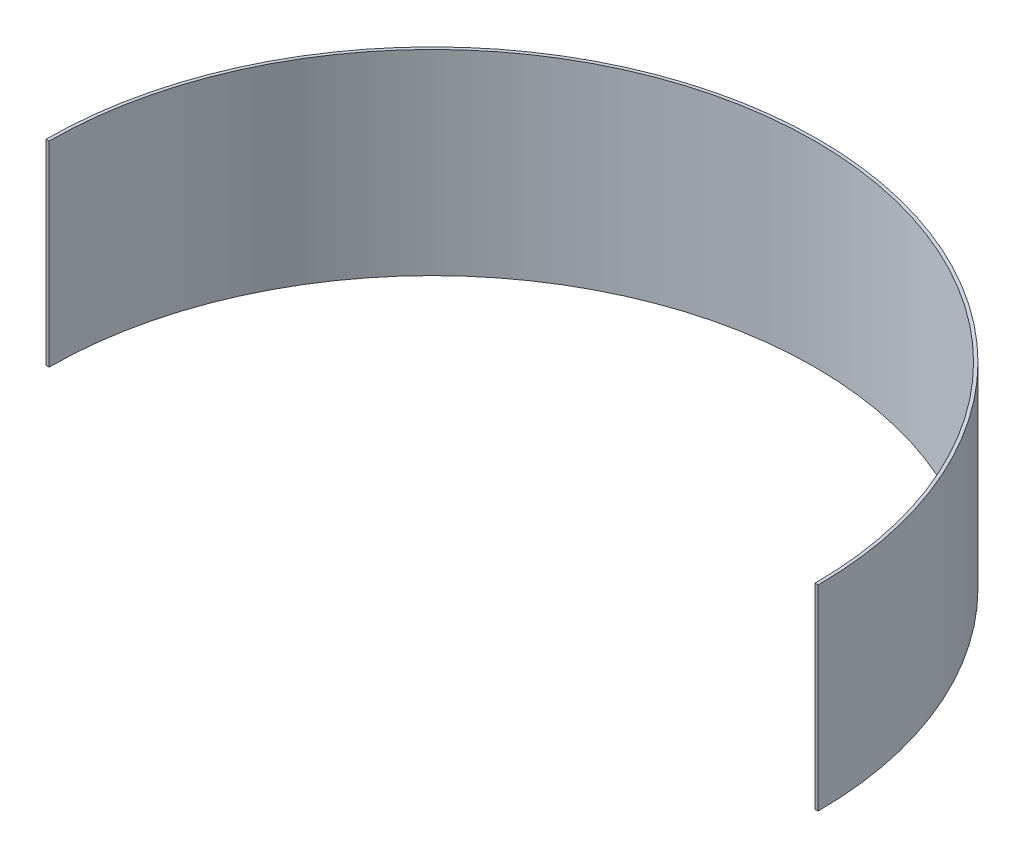
ISO-10303-21;
HEADER;
FILE_DESCRIPTION(('STEP AP214'),'2;1');
FILE_NAME('part.step','',(''),(''),'','','');
FILE_SCHEMA(('AUTOMOTIVE_DESIGN { 1 0 10303 214 1 1 1 1 }'));
ENDSEC;
DATA;
#1=APPLICATION_CONTEXT('core data for automotive mechanical design processes');
#2=APPLICATION_PROTOCOL_DEFINITION('international standard','automotive_design',2000,#1);
#3=PRODUCT_CONTEXT('',#1,'mechanical');
#4=PRODUCT('Part','Part','',(#3));
#5=PRODUCT_RELATED_PRODUCT_CATEGORY('part','',(#4));
#6=PRODUCT_DEFINITION_FORMATION('','',#4);
#7=PRODUCT_DEFINITION_CONTEXT('part definition',#1,'design');
#8=PRODUCT_DEFINITION('design','',#6,#7);
#9=PRODUCT_DEFINITION_SHAPE('','',#8);
#10=(LENGTH_UNIT() NAMED_UNIT(*) SI_UNIT(.MILLI.,.METRE.));
#11=(NAMED_UNIT(*) PLANE_ANGLE_UNIT() SI_UNIT($,.RADIAN.));
#12=(NAMED_UNIT(*) SI_UNIT($,.STERADIAN.) SOLID_ANGLE_UNIT());
#13=UNCERTAINTY_MEASURE_WITH_UNIT(LENGTH_MEASURE(1.E-05),#10,'distance_accuracy_value','');
#14=(GEOMETRIC_REPRESENTATION_CONTEXT(3) GLOBAL_UNCERTAINTY_ASSIGNED_CONTEXT((#13)) GLOBAL_UNIT_ASSIGNED_CONTEXT((#10,
#11,#12)) REPRESENTATION_CONTEXT('',''));
#15=CARTESIAN_POINT('',(0.,0.,0.));
#16=DIRECTION('',(0.,0.,1.));
#17=DIRECTION('',(1.,0.,0.));
#18=AXIS2_PLACEMENT_3D('',#15,#16,#17);
#19=CARTESIAN_POINT('',(0.,250.,0.));
#20=DIRECTION('',(0.,1.,0.));
#21=DIRECTION('',(0.,0.,1.));
#22=AXIS2_PLACEMENT_3D('',#19,#20,#21);
#23=PLANE('',#22);
#24=DIRECTION('',(-1.,0.,0.));
#25=VECTOR('',#24,1.);
#26=CARTESIAN_POINT('',(-985.5,250.,1.03638778409598E-13));
#27=LINE('',#26,#25);
#28=CARTESIAN_POINT('',(-977.5,250.,1.02169202250621E-13));
#29=VERTEX_POINT('',#28);
#30=CARTESIAN_POINT('',(-985.5,250.,1.03638778409598E-13));
#31=VERTEX_POINT('',#30);
#32=EDGE_CURVE('E12',#29,#31,#27,.T.);
#33=ORIENTED_EDGE('',*,*,#32,.F.);
#34=CARTESIAN_POINT('',(0.,250.,0.));
#35=DIRECTION('',(0.,-1.,0.));
#36=DIRECTION('',(0.,0.,-1.));
#37=AXIS2_PLACEMENT_3D('',#34,#35,#36);
#38=CIRCLE('',#37,977.5);
#39=CARTESIAN_POINT('',(977.5,250.,6.15716019112964E-12));
#40=VERTEX_POINT('',#39);
#41=EDGE_CURVE('E75',#29,#40,#38,.T.);
#42=ORIENTED_EDGE('',*,*,#41,.T.);
#43=DIRECTION('',(1.,0.,0.));
#44=VECTOR('',#43,1.);
#45=CARTESIAN_POINT('',(985.5,250.,5.98935972259897E-12));
#46=LINE('',#45,#44);
#47=CARTESIAN_POINT('',(985.5,250.,5.98935972259897E-12));
#48=VERTEX_POINT('',#47);
#49=EDGE_CURVE('E49',#40,#48,#46,.T.);
#50=ORIENTED_EDGE('',*,*,#49,.T.);
#51=CARTESIAN_POINT('',(0.,250.,0.));
#52=DIRECTION('',(0.,-1.,0.));
#53=DIRECTION('',(0.,0.,-1.));
#54=AXIS2_PLACEMENT_3D('',#51,#52,#53);
#55=CIRCLE('',#54,985.5);
#56=EDGE_CURVE('E78',#31,#48,#55,.T.);
#57=ORIENTED_EDGE('',*,*,#56,.F.);
#58=EDGE_LOOP('',(#33,#42,#50,#57));
#59=FACE_BOUND('',#58,.T.);
#60=ADVANCED_FACE('F39',(#59),#23,.T.);
#61=CARTESIAN_POINT('',(985.5,0.,6.18563175479426E-12));
#62=DIRECTION('',(0.,0.,1.));
#63=DIRECTION('',(0.,-1.,0.));
#64=AXIS2_PLACEMENT_3D('',#61,#62,#63);
#65=PLANE('',#64);
#66=ORIENTED_EDGE('',*,*,#49,.F.);
#67=DIRECTION('',(0.,-1.,0.));
#68=VECTOR('',#67,1.);
#69=CARTESIAN_POINT('',(977.5,3118.13511988646,6.15716019112964E-12));
#70=LINE('',#69,#68);
#71=CARTESIAN_POINT('',(977.5,-250.,6.15716019112964E-12));
#72=VERTEX_POINT('',#71);
#73=EDGE_CURVE('E90',#40,#72,#70,.T.);
#74=ORIENTED_EDGE('',*,*,#73,.T.);
#75=DIRECTION('',(1.,0.,0.));
#76=VECTOR('',#75,1.);
#77=CARTESIAN_POINT('',(985.5,-250.,6.18563175479426E-12));
#78=LINE('',#77,#76);
#79=CARTESIAN_POINT('',(985.5,-250.,6.18563175479426E-12));
#80=VERTEX_POINT('',#79);
#81=EDGE_CURVE('E99',#72,#80,#78,.T.);
#82=ORIENTED_EDGE('',*,*,#81,.T.);
#83=DIRECTION('',(0.,-1.,0.));
#84=VECTOR('',#83,1.);
#85=CARTESIAN_POINT('',(985.5,250.,6.18563175479426E-12));
#86=LINE('',#85,#84);
#87=EDGE_CURVE('E94',#48,#80,#86,.T.);
#88=ORIENTED_EDGE('',*,*,#87,.F.);
#89=EDGE_LOOP('',(#66,#74,#82,#88));
#90=FACE_BOUND('',#89,.T.);
#91=ADVANCED_FACE('F107',(#90),#65,.T.);
#92=CARTESIAN_POINT('',(0.,-250.,0.));
#93=DIRECTION('',(0.,-1.,0.));
#94=DIRECTION('',(0.,0.,-1.));
#95=AXIS2_PLACEMENT_3D('',#92,#93,#94);
#96=PLANE('',#95);
#97=ORIENTED_EDGE('',*,*,#81,.F.);
#98=CARTESIAN_POINT('',(0.,-250.,0.));
#99=DIRECTION('',(0.,-1.,0.));
#100=DIRECTION('',(0.,0.,-1.));
#101=AXIS2_PLACEMENT_3D('',#98,#99,#100);
#102=CIRCLE('',#101,977.5);
#103=CARTESIAN_POINT('',(-977.5,-250.,1.02169202250621E-13));
#104=VERTEX_POINT('',#103);
#105=EDGE_CURVE('E92',#72,#104,#102,.F.);
#106=ORIENTED_EDGE('',*,*,#105,.T.);
#107=DIRECTION('',(-1.,0.,0.));
#108=VECTOR('',#107,1.);
#109=CARTESIAN_POINT('',(-985.5,-250.,-2.58428047758317E-13));
#110=LINE('',#109,#108);
#111=CARTESIAN_POINT('',(-985.5,-250.,-2.58428047758317E-13));
#112=VERTEX_POINT('',#111);
#113=EDGE_CURVE('E43',#104,#112,#110,.T.);
#114=ORIENTED_EDGE('',*,*,#113,.T.);
#115=CARTESIAN_POINT('',(0.,-250.,0.));
#116=DIRECTION('',(0.,1.,0.));
#117=DIRECTION('',(0.,0.,1.));
#118=AXIS2_PLACEMENT_3D('',#115,#116,#117);
#119=CIRCLE('',#118,985.5);
#120=EDGE_CURVE('E108',#80,#112,#119,.T.);
#121=ORIENTED_EDGE('',*,*,#120,.F.);
#122=EDGE_LOOP('',(#97,#106,#114,#121));
#123=FACE_BOUND('',#122,.T.);
#124=ADVANCED_FACE('F112',(#123),#96,.T.);
#125=CARTESIAN_POINT('',(-985.5,0.,1.03638778409598E-13));
#126=DIRECTION('',(0.,0.,1.));
#127=DIRECTION('',(0.,1.,0.));
#128=AXIS2_PLACEMENT_3D('',#125,#126,#127);
#129=PLANE('',#128);
#130=DIRECTION('',(0.,-1.,0.));
#131=VECTOR('',#130,1.);
#132=CARTESIAN_POINT('',(-977.5,3118.13511988646,1.02169202250621E-13));
#133=LINE('',#132,#131);
#134=EDGE_CURVE('E88',#104,#29,#133,.F.);
#135=ORIENTED_EDGE('',*,*,#134,.T.);
#136=ORIENTED_EDGE('',*,*,#32,.T.);
#137=DIRECTION('',(0.,1.,0.));
#138=VECTOR('',#137,1.);
#139=CARTESIAN_POINT('',(-985.5,-250.,1.03638778409598E-13));
#140=LINE('',#139,#138);
#141=EDGE_CURVE('E106',#112,#31,#140,.T.);
#142=ORIENTED_EDGE('',*,*,#141,.F.);
#143=ORIENTED_EDGE('',*,*,#113,.F.);
#144=EDGE_LOOP('',(#135,#136,#142,#143));
#145=FACE_BOUND('',#144,.T.);
#146=ADVANCED_FACE('F41',(#145),#129,.T.);
#147=CARTESIAN_POINT('',(0.,3118.13511988646,0.));
#148=DIRECTION('',(0.,-1.,0.));
#149=DIRECTION('',(0.,0.,-1.));
#150=AXIS2_PLACEMENT_3D('',#147,#148,#149);
#151=CYLINDRICAL_SURFACE('',#150,985.5);
#152=ORIENTED_EDGE('',*,*,#120,.T.);
#153=ORIENTED_EDGE('',*,*,#141,.T.);
#154=ORIENTED_EDGE('',*,*,#56,.T.);
#155=ORIENTED_EDGE('',*,*,#87,.T.);
#156=EDGE_LOOP('',(#152,#153,#154,#155));
#157=FACE_BOUND('',#156,.T.);
#158=ADVANCED_FACE('F105',(#157),#151,.T.);
#159=CARTESIAN_POINT('',(0.,3118.13511988646,0.));
#160=DIRECTION('',(0.,-1.,0.));
#161=DIRECTION('',(0.,0.,-1.));
#162=AXIS2_PLACEMENT_3D('',#159,#160,#161);
#163=CYLINDRICAL_SURFACE('',#162,977.5);
#164=ORIENTED_EDGE('',*,*,#105,.F.);
#165=ORIENTED_EDGE('',*,*,#73,.F.);
#166=ORIENTED_EDGE('',*,*,#41,.F.);
#167=ORIENTED_EDGE('',*,*,#134,.F.);
#168=EDGE_LOOP('',(#164,#165,#166,#167));
#169=FACE_BOUND('',#168,.T.);
#170=ADVANCED_FACE('F87',(#169),#163,.F.);
#171=CLOSED_SHELL('',(#60,#91,#124,#146,#158,#170));
#172=MANIFOLD_SOLID_BREP('B2',#171);
#173=ADVANCED_BREP_SHAPE_REPRESENTATION('',(#18,#172),#14);
#174=SHAPE_DEFINITION_REPRESENTATION(#9,#173);
ENDSEC;
END-ISO-10303-21;
